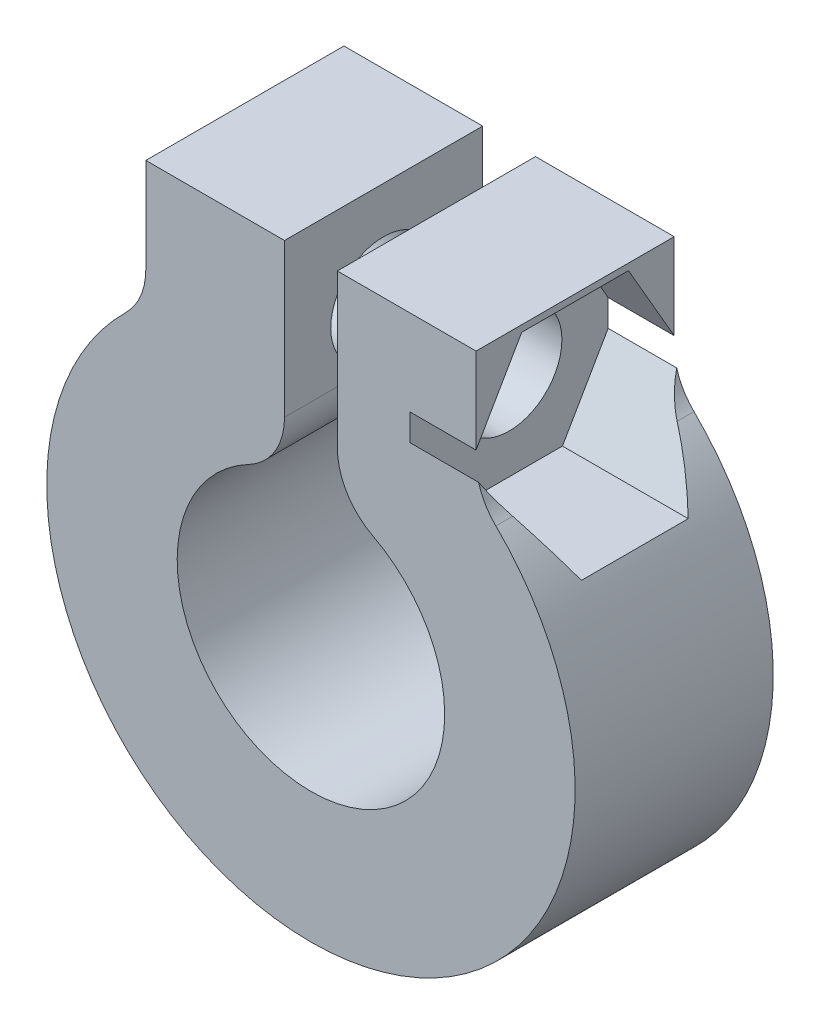
ISO-10303-21;
HEADER;
FILE_DESCRIPTION(('STEP AP214'),'2;1');
FILE_NAME('part.step','',(''),(''),'','','');
FILE_SCHEMA(('AUTOMOTIVE_DESIGN { 1 0 10303 214 1 1 1 1 }'));
ENDSEC;
DATA;
#1=APPLICATION_CONTEXT('core data for automotive mechanical design processes');
#2=APPLICATION_PROTOCOL_DEFINITION('international standard','automotive_design',2000,#1);
#3=PRODUCT_CONTEXT('',#1,'mechanical');
#4=PRODUCT('Part','Part','',(#3));
#5=PRODUCT_RELATED_PRODUCT_CATEGORY('part','',(#4));
#6=PRODUCT_DEFINITION_FORMATION('','',#4);
#7=PRODUCT_DEFINITION_CONTEXT('part definition',#1,'design');
#8=PRODUCT_DEFINITION('design','',#6,#7);
#9=PRODUCT_DEFINITION_SHAPE('','',#8);
#10=(LENGTH_UNIT() NAMED_UNIT(*) SI_UNIT(.MILLI.,.METRE.));
#11=(NAMED_UNIT(*) PLANE_ANGLE_UNIT() SI_UNIT($,.RADIAN.));
#12=(NAMED_UNIT(*) SI_UNIT($,.STERADIAN.) SOLID_ANGLE_UNIT());
#13=UNCERTAINTY_MEASURE_WITH_UNIT(LENGTH_MEASURE(1.E-05),#10,'distance_accuracy_value','');
#14=(GEOMETRIC_REPRESENTATION_CONTEXT(3) GLOBAL_UNCERTAINTY_ASSIGNED_CONTEXT((#13)) GLOBAL_UNIT_ASSIGNED_CONTEXT((#10,
#11,#12)) REPRESENTATION_CONTEXT('',''));
#15=CARTESIAN_POINT('',(0.,0.,0.));
#16=DIRECTION('',(0.,0.,1.));
#17=DIRECTION('',(1.,0.,0.));
#18=AXIS2_PLACEMENT_3D('',#15,#16,#17);
#19=CARTESIAN_POINT('',(0.,0.,6.));
#20=DIRECTION('',(0.,0.,-1.));
#21=DIRECTION('',(-1.,0.,0.));
#22=AXIS2_PLACEMENT_3D('',#19,#20,#21);
#23=CYLINDRICAL_SURFACE('',#22,8.);
#24=CARTESIAN_POINT('',(0.,0.,3.80829037686547));
#25=DIRECTION('',(0.,0.5,0.866025403784439));
#26=DIRECTION('',(0.,0.866025403784439,-0.5));
#27=AXIS2_PLACEMENT_3D('',#24,#25,#26);
#28=ELLIPSE('',#27,9.23760430703401,8.);
#29=CARTESIAN_POINT('',(6.80881781221968,4.2,1.38341924626905));
#30=VERTEX_POINT('',#29);
#31=CARTESIAN_POINT('',(5.6,5.71314274283428,0.509805876371349));
#32=VERTEX_POINT('',#31);
#33=EDGE_CURVE('E230',#30,#32,#28,.T.);
#34=ORIENTED_EDGE('',*,*,#33,.F.);
#35=DIRECTION('',(0.,0.,-1.));
#36=VECTOR('',#35,1.);
#37=CARTESIAN_POINT('',(6.80881781221968,4.2,6.));
#38=LINE('',#37,#36);
#39=CARTESIAN_POINT('',(6.80881781221968,4.2,4.61658075373095));
#40=VERTEX_POINT('',#39);
#41=EDGE_CURVE('E11',#40,#30,#38,.T.);
#42=ORIENTED_EDGE('',*,*,#41,.F.);
#43=CARTESIAN_POINT('',(0.,0.,2.19170962313452));
#44=DIRECTION('',(0.,0.5,-0.866025403784439));
#45=DIRECTION('',(0.,-0.866025403784439,-0.5));
#46=AXIS2_PLACEMENT_3D('',#43,#44,#45);
#47=ELLIPSE('',#46,9.23760430703401,8.);
#48=CARTESIAN_POINT('',(5.6,5.71314274283428,5.49019412362865));
#49=VERTEX_POINT('',#48);
#50=EDGE_CURVE('E234',#49,#40,#47,.T.);
#51=ORIENTED_EDGE('',*,*,#50,.F.);
#52=DIRECTION('',(0.,0.,-1.));
#53=VECTOR('',#52,1.);
#54=CARTESIAN_POINT('',(5.6,5.71314274283428,6.));
#55=LINE('',#54,#53);
#56=CARTESIAN_POINT('',(5.6,5.71314274283428,6.));
#57=VERTEX_POINT('',#56);
#58=EDGE_CURVE('E339',#57,#49,#55,.T.);
#59=ORIENTED_EDGE('',*,*,#58,.F.);
#60=CARTESIAN_POINT('',(0.,0.,6.));
#61=DIRECTION('',(0.,0.,1.));
#62=DIRECTION('',(1.,0.,0.));
#63=AXIS2_PLACEMENT_3D('',#60,#61,#62);
#64=CIRCLE('',#63,8.);
#65=CARTESIAN_POINT('',(-5.6,5.71314274283428,6.));
#66=VERTEX_POINT('',#65);
#67=EDGE_CURVE('E310',#66,#57,#64,.T.);
#68=ORIENTED_EDGE('',*,*,#67,.F.);
#69=DIRECTION('',(0.,0.,-1.));
#70=VECTOR('',#69,1.);
#71=CARTESIAN_POINT('',(-5.6,5.71314274283428,6.));
#72=LINE('',#71,#70);
#73=CARTESIAN_POINT('',(-5.6,5.71314274283428,5.48676464501165));
#74=VERTEX_POINT('',#73);
#75=EDGE_CURVE('E343',#66,#74,#72,.T.);
#76=ORIENTED_EDGE('',*,*,#75,.T.);
#77=CARTESIAN_POINT('',(-5.6,5.71314274283428,0.513235354988352));
#78=CARTESIAN_POINT('',(-5.65841260191976,5.65590457804368,0.542851488995459));
#79=CARTESIAN_POINT('',(-5.71527057067612,5.59839936297946,0.575119081677262));
#80=CARTESIAN_POINT('',(-5.82562419308287,5.48346636189173,0.645289685761073));
#81=CARTESIAN_POINT('',(-5.87911613340435,5.42603872747567,0.683198770863757));
#82=CARTESIAN_POINT('',(-5.98273944102367,5.31157659675637,0.765224965750875));
#83=CARTESIAN_POINT('',(-6.03284294156924,5.25454817516838,0.809386033222885));
#84=CARTESIAN_POINT('',(-6.12892003785086,5.14215905531061,0.903857474884853));
#85=CARTESIAN_POINT('',(-6.17489502518751,5.08679779930198,0.954165763426652));
#86=CARTESIAN_POINT('',(-6.26277086401282,4.97821424841746,1.06138068506756));
#87=CARTESIAN_POINT('',(-6.30463893909999,4.92501088202122,1.1183335266617));
#88=CARTESIAN_POINT('',(-6.38364875183103,4.82216078344485,1.23839168848502));
#89=CARTESIAN_POINT('',(-6.42079120193274,4.77251351562472,1.30149607873752));
#90=CARTESIAN_POINT('',(-6.49003258608079,4.67791658761923,1.43332186127946));
#91=CARTESIAN_POINT('',(-6.52214922715748,4.63295063063398,1.50202217417767));
#92=CARTESIAN_POINT('',(-6.58134669562545,4.54846508837125,1.64469103315218));
#93=CARTESIAN_POINT('',(-6.60842861398425,4.50894432366376,1.71865843309461));
#94=CARTESIAN_POINT('',(-6.67474328739514,4.41060280911192,1.924973810207));
#95=CARTESIAN_POINT('',(-6.70914735010543,4.35772694745215,2.06183154394035));
#96=CARTESIAN_POINT('',(-6.76298426782781,4.27370802874066,2.34489835679647));
#97=CARTESIAN_POINT('',(-6.7824103879135,4.24257474897026,2.49111161072321));
#98=CARTESIAN_POINT('',(-6.80530398049268,4.20574018104803,2.77474714320187));
#99=CARTESIAN_POINT('',(-6.81002418798015,4.19804386742066,2.91181235858912));
#100=CARTESIAN_POINT('',(-6.80709087408471,4.20279998385567,3.18540098733179));
#101=CARTESIAN_POINT('',(-6.79944371115395,4.2152420601443,3.32192464294849));
#102=CARTESIAN_POINT('',(-6.77202228794613,4.25914945588475,3.58783230154106));
#103=CARTESIAN_POINT('',(-6.75248779596968,4.29023849112553,3.71730367031004));
#104=CARTESIAN_POINT('',(-6.70146727470181,4.36950128295825,3.96840707582466));
#105=CARTESIAN_POINT('',(-6.66998069651043,4.41767582419596,4.09003875223201));
#106=CARTESIAN_POINT('',(-6.59444009143915,4.52967807727467,4.32466067911265));
#107=CARTESIAN_POINT('',(-6.55016073291346,4.59378327564791,4.43744525808426));
#108=CARTESIAN_POINT('',(-6.44965699243133,4.73384981886964,4.64946055614281));
#109=CARTESIAN_POINT('',(-6.3934310001081,4.80981276173628,4.74868944500189));
#110=CARTESIAN_POINT('',(-6.26546824374691,4.97549846501485,4.93864973650036));
#111=CARTESIAN_POINT('',(-6.1929286960257,5.06580909145843,5.02832171835174));
#112=CARTESIAN_POINT('',(-6.03619479086219,5.25158102061924,5.19049143542951));
#113=CARTESIAN_POINT('',(-5.95199564917434,5.34704442779881,5.2629820874143));
#114=CARTESIAN_POINT('',(-5.82102926444227,5.48811544268052,5.35735896526323));
#115=CARTESIAN_POINT('',(-5.77817937516774,5.53322716065249,5.38564977214226));
#116=CARTESIAN_POINT('',(-5.69053750000717,5.62331949426635,5.43874377830948));
#117=CARTESIAN_POINT('',(-5.64575151372547,5.66830011028851,5.46355686459065));
#118=CARTESIAN_POINT('',(-5.6,5.71314274283428,5.48676464501165));
#119=B_SPLINE_CURVE_WITH_KNOTS('',3,(#77,#78,#79,#80,#81,#82,#83,#84,#85,#86,#87,#88,#89,#90,
#91,#92,#93,#94,#95,#96,#97,#98,#99,#100,#101,#102,#103,#104,#105,#106,#107,#108,#109,#110,#111,
#112,#113,#114,#115,#116,#117,#118),.UNSPECIFIED.,.F.,.F.,(4,2,2,2,2,2,2,2,2,2,2,2,2,2,2,2,2,2,
2,2,4),(0.,0.260934741232692,0.522152468081195,0.785307564400675,1.04837362327335,
1.31339246721466,1.57837130818092,1.84239446435727,2.10636034284591,2.55575775770598,
3.00535712929024,3.41543442073293,3.82530094562444,4.22716247046868,4.6290424530504,
5.03848456590687,5.44798190526189,5.88574684000295,6.32369193670887,6.52864397831804,
6.73300098948912),.UNSPECIFIED.);
#120=CARTESIAN_POINT('',(-5.6,5.71314274283428,0.513235354988351));
#121=VERTEX_POINT('',#120);
#122=EDGE_CURVE('E269',#121,#74,#119,.T.);
#123=ORIENTED_EDGE('',*,*,#122,.F.);
#124=CARTESIAN_POINT('',(-5.6,5.71314274283428,0.));
#125=VERTEX_POINT('',#124);
#126=EDGE_CURVE('E342',#121,#125,#72,.T.);
#127=ORIENTED_EDGE('',*,*,#126,.T.);
#128=CARTESIAN_POINT('',(0.,0.,0.));
#129=DIRECTION('',(0.,0.,1.));
#130=DIRECTION('',(1.,0.,0.));
#131=AXIS2_PLACEMENT_3D('',#128,#129,#130);
#132=CIRCLE('',#131,8.);
#133=CARTESIAN_POINT('',(5.6,5.71314274283428,0.));
#134=VERTEX_POINT('',#133);
#135=EDGE_CURVE('E290',#125,#134,#132,.T.);
#136=ORIENTED_EDGE('',*,*,#135,.T.);
#137=EDGE_CURVE('E312',#32,#134,#55,.T.);
#138=ORIENTED_EDGE('',*,*,#137,.F.);
#139=EDGE_LOOP('',(#34,#42,#51,#59,#68,#76,#123,#127,#136,#138));
#140=FACE_BOUND('',#139,.T.);
#141=ADVANCED_FACE('F36',(#140),#23,.T.);
#142=CARTESIAN_POINT('',(7.,7.14142842854285,6.));
#143=DIRECTION('',(0.,0.,-1.));
#144=DIRECTION('',(-1.,0.,0.));
#145=AXIS2_PLACEMENT_3D('',#142,#143,#144);
#146=CYLINDRICAL_SURFACE('',#145,2.);
#147=CARTESIAN_POINT('',(7.,7.14142842854285,-0.314815248752183));
#148=DIRECTION('',(0.,0.5,0.866025403784439));
#149=DIRECTION('',(0.,0.866025403784439,-0.5));
#150=AXIS2_PLACEMENT_3D('',#147,#148,#149);
#151=ELLIPSE('',#150,2.3094010767585,2.);
#152=CARTESIAN_POINT('',(5.07576662604057,6.59615242270663,0.));
#153=VERTEX_POINT('',#152);
#154=EDGE_CURVE('E228',#32,#153,#151,.F.);
#155=ORIENTED_EDGE('',*,*,#154,.F.);
#156=ORIENTED_EDGE('',*,*,#137,.T.);
#157=CARTESIAN_POINT('',(7.,7.14142842854285,0.));
#158=DIRECTION('',(0.,0.,-1.));
#159=DIRECTION('',(1.,0.,0.));
#160=AXIS2_PLACEMENT_3D('',#157,#158,#159);
#161=CIRCLE('',#160,2.);
#162=EDGE_CURVE('E285',#134,#153,#161,.T.);
#163=ORIENTED_EDGE('',*,*,#162,.T.);
#164=EDGE_LOOP('',(#155,#156,#163));
#165=FACE_BOUND('',#164,.T.);
#166=ADVANCED_FACE('F38',(#165),#146,.F.);
#167=CARTESIAN_POINT('',(7.,7.14142842854285,6.31481524875218));
#168=DIRECTION('',(0.,0.5,-0.866025403784439));
#169=DIRECTION('',(0.,-0.866025403784439,-0.5));
#170=AXIS2_PLACEMENT_3D('',#167,#168,#169);
#171=ELLIPSE('',#170,2.3094010767585,2.);
#172=CARTESIAN_POINT('',(5.07576662604057,6.59615242270663,6.));
#173=VERTEX_POINT('',#172);
#174=EDGE_CURVE('E232',#173,#49,#171,.F.);
#175=ORIENTED_EDGE('',*,*,#174,.F.);
#176=CARTESIAN_POINT('',(7.,7.14142842854285,6.));
#177=DIRECTION('',(0.,0.,-1.));
#178=DIRECTION('',(1.,0.,0.));
#179=AXIS2_PLACEMENT_3D('',#176,#177,#178);
#180=CIRCLE('',#179,2.);
#181=EDGE_CURVE('E286',#57,#173,#180,.T.);
#182=ORIENTED_EDGE('',*,*,#181,.F.);
#183=ORIENTED_EDGE('',*,*,#58,.T.);
#184=EDGE_LOOP('',(#175,#182,#183));
#185=FACE_BOUND('',#184,.T.);
#186=ADVANCED_FACE('F400',(#185),#146,.F.);
#187=CARTESIAN_POINT('',(5.,10.,6.));
#188=DIRECTION('',(-1.,0.,0.));
#189=DIRECTION('',(0.,0.,1.));
#190=AXIS2_PLACEMENT_3D('',#187,#188,#189);
#191=PLANE('',#190);
#192=DIRECTION('',(0.,0.866025403784439,0.5));
#193=VECTOR('',#192,1.);
#194=CARTESIAN_POINT('',(5.,11.9490381056767,2.62416697508023));
#195=LINE('',#194,#193);
#196=CARTESIAN_POINT('',(5.,7.40384757729337,0.));
#197=VERTEX_POINT('',#196);
#198=CARTESIAN_POINT('',(5.,9.8,1.38341924626905));
#199=VERTEX_POINT('',#198);
#200=EDGE_CURVE('E191',#197,#199,#195,.T.);
#201=ORIENTED_EDGE('',*,*,#200,.F.);
#202=DIRECTION('',(0.,1.,0.));
#203=VECTOR('',#202,1.);
#204=CARTESIAN_POINT('',(5.,10.,0.));
#205=LINE('',#204,#203);
#206=CARTESIAN_POINT('',(5.,10.,0.));
#207=VERTEX_POINT('',#206);
#208=EDGE_CURVE('E315',#197,#207,#205,.T.);
#209=ORIENTED_EDGE('',*,*,#208,.T.);
#210=DIRECTION('',(0.,0.,-1.));
#211=VECTOR('',#210,1.);
#212=CARTESIAN_POINT('',(5.,10.,6.));
#213=LINE('',#212,#211);
#214=CARTESIAN_POINT('',(5.,10.,6.));
#215=VERTEX_POINT('',#214);
#216=EDGE_CURVE('E371',#215,#207,#213,.T.);
#217=ORIENTED_EDGE('',*,*,#216,.F.);
#218=DIRECTION('',(0.,1.,0.));
#219=VECTOR('',#218,1.);
#220=CARTESIAN_POINT('',(5.,10.,6.));
#221=LINE('',#220,#219);
#222=CARTESIAN_POINT('',(5.,7.40384757729336,6.));
#223=VERTEX_POINT('',#222);
#224=EDGE_CURVE('E289',#223,#215,#221,.T.);
#225=ORIENTED_EDGE('',*,*,#224,.F.);
#226=DIRECTION('',(0.,-0.866025403784439,0.5));
#227=VECTOR('',#226,1.);
#228=CARTESIAN_POINT('',(5.,9.35096189432334,4.87583302491977));
#229=LINE('',#228,#227);
#230=CARTESIAN_POINT('',(5.,9.8,4.61658075373095));
#231=VERTEX_POINT('',#230);
#232=EDGE_CURVE('E236',#231,#223,#229,.T.);
#233=ORIENTED_EDGE('',*,*,#232,.F.);
#234=DIRECTION('',(0.,0.,1.));
#235=VECTOR('',#234,1.);
#236=CARTESIAN_POINT('',(5.,9.8,6.));
#237=LINE('',#236,#235);
#238=EDGE_CURVE('E44',#199,#231,#237,.T.);
#239=ORIENTED_EDGE('',*,*,#238,.F.);
#240=EDGE_LOOP('',(#201,#209,#217,#225,#233,#239));
#241=FACE_BOUND('',#240,.T.);
#242=ADVANCED_FACE('F409',(#241),#191,.F.);
#243=CARTESIAN_POINT('',(7.,7.14142842854285,6.));
#244=DIRECTION('',(0.,0.,1.));
#245=DIRECTION('',(1.,0.,0.));
#246=AXIS2_PLACEMENT_3D('',#243,#244,#245);
#247=PLANE('',#246);
#248=DIRECTION('',(0.,1.,0.));
#249=VECTOR('',#248,1.);
#250=CARTESIAN_POINT('',(3.,7.14142842854285,6.));
#251=LINE('',#250,#249);
#252=CARTESIAN_POINT('',(3.,6.59615242270663,6.));
#253=VERTEX_POINT('',#252);
#254=CARTESIAN_POINT('',(3.,7.40384757729336,6.));
#255=VERTEX_POINT('',#254);
#256=EDGE_CURVE('E224',#253,#255,#251,.T.);
#257=ORIENTED_EDGE('',*,*,#256,.T.);
#258=DIRECTION('',(1.,0.,0.));
#259=VECTOR('',#258,1.);
#260=CARTESIAN_POINT('',(7.,7.40384757729336,6.));
#261=LINE('',#260,#259);
#262=EDGE_CURVE('E417',#255,#223,#261,.T.);
#263=ORIENTED_EDGE('',*,*,#262,.T.);
#264=ORIENTED_EDGE('',*,*,#224,.T.);
#265=DIRECTION('',(-1.,0.,0.));
#266=VECTOR('',#265,1.);
#267=CARTESIAN_POINT('',(0.8,10.,6.));
#268=LINE('',#267,#266);
#269=CARTESIAN_POINT('',(0.8,10.,6.));
#270=VERTEX_POINT('',#269);
#271=EDGE_CURVE('E292',#215,#270,#268,.T.);
#272=ORIENTED_EDGE('',*,*,#271,.T.);
#273=DIRECTION('',(0.,-1.,0.));
#274=VECTOR('',#273,1.);
#275=CARTESIAN_POINT('',(0.8,10.,6.));
#276=LINE('',#275,#274);
#277=CARTESIAN_POINT('',(0.8,5.36306815172062,6.));
#278=VERTEX_POINT('',#277);
#279=EDGE_CURVE('E294',#270,#278,#276,.T.);
#280=ORIENTED_EDGE('',*,*,#279,.T.);
#281=CARTESIAN_POINT('',(2.8,5.36306815172062,6.));
#282=DIRECTION('',(0.,0.,1.));
#283=DIRECTION('',(-1.,0.,0.));
#284=AXIS2_PLACEMENT_3D('',#281,#282,#283);
#285=CIRCLE('',#284,2.);
#286=CARTESIAN_POINT('',(1.87438016528926,3.59015306024273,6.));
#287=VERTEX_POINT('',#286);
#288=EDGE_CURVE('E296',#278,#287,#285,.T.);
#289=ORIENTED_EDGE('',*,*,#288,.T.);
#290=CARTESIAN_POINT('',(0.,0.,6.));
#291=DIRECTION('',(0.,0.,-1.));
#292=DIRECTION('',(1.,0.,0.));
#293=AXIS2_PLACEMENT_3D('',#290,#291,#292);
#294=CIRCLE('',#293,4.05);
#295=CARTESIAN_POINT('',(-1.87438016528926,3.59015306024273,6.));
#296=VERTEX_POINT('',#295);
#297=EDGE_CURVE('E298',#287,#296,#294,.T.);
#298=ORIENTED_EDGE('',*,*,#297,.T.);
#299=CARTESIAN_POINT('',(-2.8,5.36306815172062,6.));
#300=DIRECTION('',(0.,0.,1.));
#301=DIRECTION('',(-1.,0.,0.));
#302=AXIS2_PLACEMENT_3D('',#299,#300,#301);
#303=CIRCLE('',#302,2.);
#304=CARTESIAN_POINT('',(-0.799999999999999,5.36306815172062,6.));
#305=VERTEX_POINT('',#304);
#306=EDGE_CURVE('E300',#296,#305,#303,.T.);
#307=ORIENTED_EDGE('',*,*,#306,.T.);
#308=DIRECTION('',(0.,1.,0.));
#309=VECTOR('',#308,1.);
#310=CARTESIAN_POINT('',(-0.8,10.,6.));
#311=LINE('',#310,#309);
#312=CARTESIAN_POINT('',(-0.8,10.,6.));
#313=VERTEX_POINT('',#312);
#314=EDGE_CURVE('E302',#305,#313,#311,.T.);
#315=ORIENTED_EDGE('',*,*,#314,.T.);
#316=DIRECTION('',(-1.,0.,0.));
#317=VECTOR('',#316,1.);
#318=CARTESIAN_POINT('',(-5.,10.,6.));
#319=LINE('',#318,#317);
#320=CARTESIAN_POINT('',(-5.,10.,6.));
#321=VERTEX_POINT('',#320);
#322=EDGE_CURVE('E304',#313,#321,#319,.T.);
#323=ORIENTED_EDGE('',*,*,#322,.T.);
#324=DIRECTION('',(0.,-1.,0.));
#325=VECTOR('',#324,1.);
#326=CARTESIAN_POINT('',(-5.,7.14142842854285,6.));
#327=LINE('',#326,#325);
#328=CARTESIAN_POINT('',(-5.,7.14142842854285,6.));
#329=VERTEX_POINT('',#328);
#330=EDGE_CURVE('E306',#321,#329,#327,.T.);
#331=ORIENTED_EDGE('',*,*,#330,.T.);
#332=CARTESIAN_POINT('',(-7.,7.14142842854285,6.));
#333=DIRECTION('',(0.,0.,-1.));
#334=DIRECTION('',(-1.,0.,0.));
#335=AXIS2_PLACEMENT_3D('',#332,#333,#334);
#336=CIRCLE('',#335,2.);
#337=EDGE_CURVE('E308',#329,#66,#336,.T.);
#338=ORIENTED_EDGE('',*,*,#337,.T.);
#339=ORIENTED_EDGE('',*,*,#67,.T.);
#340=ORIENTED_EDGE('',*,*,#181,.T.);
#341=DIRECTION('',(-1.,0.,0.));
#342=VECTOR('',#341,1.);
#343=CARTESIAN_POINT('',(7.,6.59615242270663,6.));
#344=LINE('',#343,#342);
#345=EDGE_CURVE('E419',#173,#253,#344,.T.);
#346=ORIENTED_EDGE('',*,*,#345,.T.);
#347=EDGE_LOOP('',(#257,#263,#264,#272,#280,#289,#298,#307,#315,#323,#331,#338,#339,#340,#346));
#348=FACE_BOUND('',#347,.T.);
#349=ADVANCED_FACE('F406',(#348),#247,.T.);
#350=CARTESIAN_POINT('',(7.,7.14142842854285,0.));
#351=DIRECTION('',(0.,0.,1.));
#352=DIRECTION('',(1.,0.,0.));
#353=AXIS2_PLACEMENT_3D('',#350,#351,#352);
#354=PLANE('',#353);
#355=DIRECTION('',(-1.,0.,0.));
#356=VECTOR('',#355,1.);
#357=CARTESIAN_POINT('',(7.,6.59615242270663,0.));
#358=LINE('',#357,#356);
#359=CARTESIAN_POINT('',(3.,6.59615242270663,0.));
#360=VERTEX_POINT('',#359);
#361=EDGE_CURVE('E440',#153,#360,#358,.T.);
#362=ORIENTED_EDGE('',*,*,#361,.F.);
#363=ORIENTED_EDGE('',*,*,#162,.F.);
#364=ORIENTED_EDGE('',*,*,#135,.F.);
#365=CARTESIAN_POINT('',(-7.,7.14142842854285,0.));
#366=DIRECTION('',(0.,0.,-1.));
#367=DIRECTION('',(-1.,0.,0.));
#368=AXIS2_PLACEMENT_3D('',#365,#366,#367);
#369=CIRCLE('',#368,2.);
#370=CARTESIAN_POINT('',(-5.,7.14142842854285,0.));
#371=VERTEX_POINT('',#370);
#372=EDGE_CURVE('E334',#371,#125,#369,.T.);
#373=ORIENTED_EDGE('',*,*,#372,.F.);
#374=DIRECTION('',(0.,-1.,0.));
#375=VECTOR('',#374,1.);
#376=CARTESIAN_POINT('',(-5.,7.14142842854285,0.));
#377=LINE('',#376,#375);
#378=CARTESIAN_POINT('',(-5.,10.,0.));
#379=VERTEX_POINT('',#378);
#380=EDGE_CURVE('E331',#379,#371,#377,.T.);
#381=ORIENTED_EDGE('',*,*,#380,.F.);
#382=DIRECTION('',(-1.,0.,0.));
#383=VECTOR('',#382,1.);
#384=CARTESIAN_POINT('',(-5.,10.,0.));
#385=LINE('',#384,#383);
#386=CARTESIAN_POINT('',(-0.8,10.,0.));
#387=VERTEX_POINT('',#386);
#388=EDGE_CURVE('E329',#387,#379,#385,.T.);
#389=ORIENTED_EDGE('',*,*,#388,.F.);
#390=DIRECTION('',(0.,1.,0.));
#391=VECTOR('',#390,1.);
#392=CARTESIAN_POINT('',(-0.8,10.,0.));
#393=LINE('',#392,#391);
#394=CARTESIAN_POINT('',(-0.799999999999999,5.36306815172062,0.));
#395=VERTEX_POINT('',#394);
#396=EDGE_CURVE('E327',#395,#387,#393,.T.);
#397=ORIENTED_EDGE('',*,*,#396,.F.);
#398=CARTESIAN_POINT('',(-2.8,5.36306815172062,0.));
#399=DIRECTION('',(0.,0.,1.));
#400=DIRECTION('',(-1.,0.,0.));
#401=AXIS2_PLACEMENT_3D('',#398,#399,#400);
#402=CIRCLE('',#401,2.);
#403=CARTESIAN_POINT('',(-1.87438016528926,3.59015306024273,0.));
#404=VERTEX_POINT('',#403);
#405=EDGE_CURVE('E325',#404,#395,#402,.T.);
#406=ORIENTED_EDGE('',*,*,#405,.F.);
#407=CARTESIAN_POINT('',(0.,0.,0.));
#408=DIRECTION('',(0.,0.,-1.));
#409=DIRECTION('',(1.,0.,0.));
#410=AXIS2_PLACEMENT_3D('',#407,#408,#409);
#411=CIRCLE('',#410,4.05);
#412=CARTESIAN_POINT('',(1.87438016528926,3.59015306024273,0.));
#413=VERTEX_POINT('',#412);
#414=EDGE_CURVE('E323',#413,#404,#411,.T.);
#415=ORIENTED_EDGE('',*,*,#414,.F.);
#416=CARTESIAN_POINT('',(2.8,5.36306815172062,0.));
#417=DIRECTION('',(0.,0.,1.));
#418=DIRECTION('',(-1.,0.,0.));
#419=AXIS2_PLACEMENT_3D('',#416,#417,#418);
#420=CIRCLE('',#419,2.);
#421=CARTESIAN_POINT('',(0.8,5.36306815172062,0.));
#422=VERTEX_POINT('',#421);
#423=EDGE_CURVE('E321',#422,#413,#420,.T.);
#424=ORIENTED_EDGE('',*,*,#423,.F.);
#425=DIRECTION('',(0.,-1.,0.));
#426=VECTOR('',#425,1.);
#427=CARTESIAN_POINT('',(0.8,10.,0.));
#428=LINE('',#427,#426);
#429=CARTESIAN_POINT('',(0.8,10.,0.));
#430=VERTEX_POINT('',#429);
#431=EDGE_CURVE('E319',#430,#422,#428,.T.);
#432=ORIENTED_EDGE('',*,*,#431,.F.);
#433=DIRECTION('',(-1.,0.,0.));
#434=VECTOR('',#433,1.);
#435=CARTESIAN_POINT('',(0.8,10.,0.));
#436=LINE('',#435,#434);
#437=EDGE_CURVE('E317',#207,#430,#436,.T.);
#438=ORIENTED_EDGE('',*,*,#437,.F.);
#439=ORIENTED_EDGE('',*,*,#208,.F.);
#440=DIRECTION('',(1.,0.,0.));
#441=VECTOR('',#440,1.);
#442=CARTESIAN_POINT('',(7.,7.40384757729337,0.));
#443=LINE('',#442,#441);
#444=CARTESIAN_POINT('',(3.,7.40384757729337,0.));
#445=VERTEX_POINT('',#444);
#446=EDGE_CURVE('E441',#445,#197,#443,.T.);
#447=ORIENTED_EDGE('',*,*,#446,.F.);
#448=DIRECTION('',(0.,1.,0.));
#449=VECTOR('',#448,1.);
#450=CARTESIAN_POINT('',(3.,7.14142842854285,0.));
#451=LINE('',#450,#449);
#452=EDGE_CURVE('E205',#360,#445,#451,.T.);
#453=ORIENTED_EDGE('',*,*,#452,.F.);
#454=EDGE_LOOP('',(#362,#363,#364,#373,#381,#389,#397,#406,#415,#424,#432,#438,#439,#447,#453));
#455=FACE_BOUND('',#454,.T.);
#456=ADVANCED_FACE('F393',(#455),#354,.F.);
#457=CARTESIAN_POINT('',(8.,7.,3.));
#458=DIRECTION('',(-1.,0.,0.));
#459=DIRECTION('',(0.,0.,1.));
#460=AXIS2_PLACEMENT_3D('',#457,#458,#459);
#461=CYLINDRICAL_SURFACE('',#460,1.6);
#462=CARTESIAN_POINT('',(0.8,7.,3.));
#463=DIRECTION('',(1.,0.,0.));
#464=DIRECTION('',(0.,1.,0.));
#465=AXIS2_PLACEMENT_3D('',#462,#463,#464);
#466=CIRCLE('',#465,1.6);
#467=CARTESIAN_POINT('',(0.8,8.6,3.));
#468=VERTEX_POINT('',#467);
#469=EDGE_CURVE('E282',#468,#468,#466,.T.);
#470=ORIENTED_EDGE('',*,*,#469,.F.);
#471=EDGE_LOOP('',(#470));
#472=FACE_BOUND('',#471,.T.);
#473=CARTESIAN_POINT('',(3.,7.,3.));
#474=DIRECTION('',(1.,0.,0.));
#475=DIRECTION('',(0.,0.,-1.));
#476=AXIS2_PLACEMENT_3D('',#473,#474,#475);
#477=CIRCLE('',#476,1.6);
#478=CARTESIAN_POINT('',(3.,7.,1.4));
#479=VERTEX_POINT('',#478);
#480=EDGE_CURVE('E195',#479,#479,#477,.F.);
#481=ORIENTED_EDGE('',*,*,#480,.F.);
#482=EDGE_LOOP('',(#481));
#483=FACE_BOUND('',#482,.T.);
#484=ADVANCED_FACE('F264',(#472,#483),#461,.F.);
#485=CARTESIAN_POINT('',(-7.,7.14142842854285,6.));
#486=DIRECTION('',(0.,0.,-1.));
#487=DIRECTION('',(-1.,0.,0.));
#488=AXIS2_PLACEMENT_3D('',#485,#486,#487);
#489=CYLINDRICAL_SURFACE('',#488,2.);
#490=CARTESIAN_POINT('',(-5.,7.14142842854285,0.203574066848919));
#491=CARTESIAN_POINT('',(-4.99998996376799,7.09246534031337,0.201087071048072));
#492=CARTESIAN_POINT('',(-5.00179774636285,7.04344120781381,0.199907345850637));
#493=CARTESIAN_POINT('',(-5.00900150388293,6.94568551985948,0.200103208814733));
#494=CARTESIAN_POINT('',(-5.01439574552152,6.89695383454263,0.201477563200186));
#495=CARTESIAN_POINT('',(-5.02867006226468,6.80052117395843,0.2066999505779));
#496=CARTESIAN_POINT('',(-5.0375230637454,6.75281515839544,0.210528915661002));
#497=CARTESIAN_POINT('',(-5.05859918232329,6.65841191332633,0.220508304838398));
#498=CARTESIAN_POINT('',(-5.07082249282626,6.61171474187881,0.226658862165163));
#499=CARTESIAN_POINT('',(-5.11230031752735,6.47376124524569,0.248327725730303));
#500=CARTESIAN_POINT('',(-5.14639775408109,6.38441148245148,0.267077050455166));
#501=CARTESIAN_POINT('',(-5.22616874797217,6.21270328285261,0.311492030066029));
#502=CARTESIAN_POINT('',(-5.2718732482938,6.13036433202235,0.337176184090974));
#503=CARTESIAN_POINT('',(-5.36297286910296,5.99006350391405,0.387646357552761));
#504=CARTESIAN_POINT('',(-5.40652047637716,5.93055965107558,0.411542237251799));
#505=CARTESIAN_POINT('',(-5.49919800497105,5.81745557498976,0.461220251226978));
#506=CARTESIAN_POINT('',(-5.54829991110103,5.76382819280053,0.486992704487246));
#507=CARTESIAN_POINT('',(-5.6,5.71314274283428,0.51323535498835));
#508=B_SPLINE_CURVE_WITH_KNOTS('',3,(#490,#491,#492,#493,#494,#495,#496,#497,#498,#499,#500,
#501,#502,#503,#504,#505,#506,#507),.UNSPECIFIED.,.F.,.F.,(4,2,2,2,2,2,2,2,4),(0.,
0.147019442153003,0.293967883416141,0.439788408885574,0.585617304034617,0.876580774415455,
1.1683282122943,1.40042269863954,1.63139474992941),.UNSPECIFIED.);
#509=CARTESIAN_POINT('',(-5.,7.14142842854285,0.203574066848919));
#510=VERTEX_POINT('',#509);
#511=EDGE_CURVE('E59',#510,#121,#508,.T.);
#512=ORIENTED_EDGE('',*,*,#511,.F.);
#513=DIRECTION('',(0.,0.,-1.));
#514=VECTOR('',#513,1.);
#515=CARTESIAN_POINT('',(-5.,7.14142842854285,6.));
#516=LINE('',#515,#514);
#517=EDGE_CURVE('E346',#510,#371,#516,.T.);
#518=ORIENTED_EDGE('',*,*,#517,.T.);
#519=ORIENTED_EDGE('',*,*,#372,.T.);
#520=ORIENTED_EDGE('',*,*,#126,.F.);
#521=EDGE_LOOP('',(#512,#518,#519,#520));
#522=FACE_BOUND('',#521,.T.);
#523=ADVANCED_FACE('F251',(#522),#489,.F.);
#524=CARTESIAN_POINT('',(-5.,7.14142842854285,6.));
#525=DIRECTION('',(1.,0.,0.));
#526=DIRECTION('',(0.,0.,-1.));
#527=AXIS2_PLACEMENT_3D('',#524,#525,#526);
#528=PLANE('',#527);
#529=CARTESIAN_POINT('',(-5.,7.,3.));
#530=DIRECTION('',(1.,0.,0.));
#531=DIRECTION('',(0.,0.,-1.));
#532=AXIS2_PLACEMENT_3D('',#529,#530,#531);
#533=CIRCLE('',#532,2.8);
#534=CARTESIAN_POINT('',(-5.,7.14142842854285,5.79642593315108));
#535=VERTEX_POINT('',#534);
#536=EDGE_CURVE('E249',#535,#510,#533,.F.);
#537=ORIENTED_EDGE('',*,*,#536,.F.);
#538=EDGE_CURVE('E347',#329,#535,#516,.T.);
#539=ORIENTED_EDGE('',*,*,#538,.F.);
#540=ORIENTED_EDGE('',*,*,#330,.F.);
#541=DIRECTION('',(0.,0.,-1.));
#542=VECTOR('',#541,1.);
#543=CARTESIAN_POINT('',(-5.,10.,6.));
#544=LINE('',#543,#542);
#545=EDGE_CURVE('E350',#321,#379,#544,.T.);
#546=ORIENTED_EDGE('',*,*,#545,.T.);
#547=ORIENTED_EDGE('',*,*,#380,.T.);
#548=ORIENTED_EDGE('',*,*,#517,.F.);
#549=EDGE_LOOP('',(#537,#539,#540,#546,#547,#548));
#550=FACE_BOUND('',#549,.T.);
#551=ADVANCED_FACE('F389',(#550),#528,.F.);
#552=CARTESIAN_POINT('',(-5.6,5.71314274283428,5.48676464501165));
#553=CARTESIAN_POINT('',(-5.56258857560063,5.74982057747006,5.50574592368518));
#554=CARTESIAN_POINT('',(-5.52655835885979,5.78801342463516,5.52447956367441));
#555=CARTESIAN_POINT('',(-5.45740276849682,5.86739038233268,5.56107534142412));
#556=CARTESIAN_POINT('',(-5.4242796951116,5.90857681522679,5.57893678420106));
#557=CARTESIAN_POINT('',(-5.3291040605532,6.03710775131483,5.63085731496787));
#558=CARTESIAN_POINT('',(-5.27180329989331,6.12888018846157,5.66296041429284));
#559=CARTESIAN_POINT('',(-5.17174585647378,6.32322345545918,5.71886239250416));
#560=CARTESIAN_POINT('',(-5.12907298240879,6.42585224160728,5.74261343871519));
#561=CARTESIAN_POINT('',(-5.07814461035301,6.58503455527849,5.76960389347774));
#562=CARTESIAN_POINT('',(-5.06336578215806,6.63885190481831,5.77715460437165));
#563=CARTESIAN_POINT('',(-5.03831315849215,6.74785043017975,5.7891606925793));
#564=CARTESIAN_POINT('',(-5.02803647799719,6.8030307085997,5.79361805321766));
#565=CARTESIAN_POINT('',(-5.01341837535355,6.90536985810602,5.79879183128542));
#566=CARTESIAN_POINT('',(-5.00839290774714,6.9524086052877,5.79999049772663));
#567=CARTESIAN_POINT('',(-5.00167738948899,7.04679177973872,5.80000944881444));
#568=CARTESIAN_POINT('',(-4.99999216250759,7.09413655016817,5.79882629881842));
#569=CARTESIAN_POINT('',(-4.99999999999991,7.14142842854283,5.79642593315119));
#570=B_SPLINE_CURVE_WITH_KNOTS('',3,(#552,#553,#554,#555,#556,#557,#558,#559,#560,#561,#562,
#563,#564,#565,#566,#567,#568,#569),.UNSPECIFIED.,.F.,.F.,(4,2,2,2,2,2,2,2,4),(0.,
0.16709918985332,0.334329424615073,0.671259107259777,1.01008812799884,1.17880658346646,
1.34741676364676,1.48920881153731,1.63120547379215),.UNSPECIFIED.);
#571=EDGE_CURVE('E242',#74,#535,#570,.T.);
#572=ORIENTED_EDGE('',*,*,#571,.F.);
#573=ORIENTED_EDGE('',*,*,#75,.F.);
#574=ORIENTED_EDGE('',*,*,#337,.F.);
#575=ORIENTED_EDGE('',*,*,#538,.T.);
#576=EDGE_LOOP('',(#572,#573,#574,#575));
#577=FACE_BOUND('',#576,.T.);
#578=ADVANCED_FACE('F380',(#577),#489,.F.);
#579=CARTESIAN_POINT('',(-0.8,7.,3.));
#580=DIRECTION('',(-1.,0.,0.));
#581=DIRECTION('',(0.,-1.,0.));
#582=AXIS2_PLACEMENT_3D('',#579,#580,#581);
#583=CIRCLE('',#582,1.6);
#584=CARTESIAN_POINT('',(-0.8,5.4,3.));
#585=VERTEX_POINT('',#584);
#586=EDGE_CURVE('E279',#585,#585,#583,.T.);
#587=ORIENTED_EDGE('',*,*,#586,.F.);
#588=EDGE_LOOP('',(#587));
#589=FACE_BOUND('',#588,.T.);
#590=CARTESIAN_POINT('',(-4.,7.,3.));
#591=DIRECTION('',(-1.,0.,0.));
#592=DIRECTION('',(0.,0.,1.));
#593=AXIS2_PLACEMENT_3D('',#590,#591,#592);
#594=CIRCLE('',#593,1.6);
#595=CARTESIAN_POINT('',(-4.,7.,4.6));
#596=VERTEX_POINT('',#595);
#597=EDGE_CURVE('E241',#596,#596,#594,.F.);
#598=ORIENTED_EDGE('',*,*,#597,.F.);
#599=EDGE_LOOP('',(#598));
#600=FACE_BOUND('',#599,.T.);
#601=ADVANCED_FACE('F377',(#589,#600),#461,.F.);
#602=CARTESIAN_POINT('',(0.8,10.,6.));
#603=DIRECTION('',(0.,-1.,0.));
#604=DIRECTION('',(0.,0.,-1.));
#605=AXIS2_PLACEMENT_3D('',#602,#603,#604);
#606=PLANE('',#605);
#607=ORIENTED_EDGE('',*,*,#437,.T.);
#608=DIRECTION('',(0.,0.,-1.));
#609=VECTOR('',#608,1.);
#610=CARTESIAN_POINT('',(0.8,10.,6.));
#611=LINE('',#610,#609);
#612=EDGE_CURVE('E368',#270,#430,#611,.T.);
#613=ORIENTED_EDGE('',*,*,#612,.F.);
#614=ORIENTED_EDGE('',*,*,#271,.F.);
#615=ORIENTED_EDGE('',*,*,#216,.T.);
#616=EDGE_LOOP('',(#607,#613,#614,#615));
#617=FACE_BOUND('',#616,.T.);
#618=ADVANCED_FACE('F379',(#617),#606,.F.);
#619=CARTESIAN_POINT('',(0.8,10.,6.));
#620=DIRECTION('',(1.,0.,0.));
#621=DIRECTION('',(0.,1.,0.));
#622=AXIS2_PLACEMENT_3D('',#619,#620,#621);
#623=PLANE('',#622);
#624=ORIENTED_EDGE('',*,*,#469,.T.);
#625=EDGE_LOOP('',(#624));
#626=FACE_BOUND('',#625,.T.);
#627=ORIENTED_EDGE('',*,*,#431,.T.);
#628=DIRECTION('',(0.,0.,-1.));
#629=VECTOR('',#628,1.);
#630=CARTESIAN_POINT('',(0.8,5.36306815172062,6.));
#631=LINE('',#630,#629);
#632=EDGE_CURVE('E365',#278,#422,#631,.T.);
#633=ORIENTED_EDGE('',*,*,#632,.F.);
#634=ORIENTED_EDGE('',*,*,#279,.F.);
#635=ORIENTED_EDGE('',*,*,#612,.T.);
#636=EDGE_LOOP('',(#627,#633,#634,#635));
#637=FACE_BOUND('',#636,.T.);
#638=ADVANCED_FACE('F386',(#626,#637),#623,.F.);
#639=CARTESIAN_POINT('',(2.8,5.36306815172062,6.));
#640=DIRECTION('',(0.,0.,-1.));
#641=DIRECTION('',(-1.,0.,0.));
#642=AXIS2_PLACEMENT_3D('',#639,#640,#641);
#643=CYLINDRICAL_SURFACE('',#642,2.);
#644=ORIENTED_EDGE('',*,*,#423,.T.);
#645=DIRECTION('',(0.,0.,-1.));
#646=VECTOR('',#645,1.);
#647=CARTESIAN_POINT('',(1.87438016528926,3.59015306024273,6.));
#648=LINE('',#647,#646);
#649=EDGE_CURVE('E362',#287,#413,#648,.T.);
#650=ORIENTED_EDGE('',*,*,#649,.F.);
#651=ORIENTED_EDGE('',*,*,#288,.F.);
#652=ORIENTED_EDGE('',*,*,#632,.T.);
#653=EDGE_LOOP('',(#644,#650,#651,#652));
#654=FACE_BOUND('',#653,.T.);
#655=ADVANCED_FACE('F461',(#654),#643,.T.);
#656=CARTESIAN_POINT('',(0.,0.,6.));
#657=DIRECTION('',(0.,0.,-1.));
#658=DIRECTION('',(-1.,0.,0.));
#659=AXIS2_PLACEMENT_3D('',#656,#657,#658);
#660=CYLINDRICAL_SURFACE('',#659,4.05);
#661=ORIENTED_EDGE('',*,*,#414,.T.);
#662=DIRECTION('',(0.,0.,-1.));
#663=VECTOR('',#662,1.);
#664=CARTESIAN_POINT('',(-1.87438016528926,3.59015306024273,6.));
#665=LINE('',#664,#663);
#666=EDGE_CURVE('E359',#296,#404,#665,.T.);
#667=ORIENTED_EDGE('',*,*,#666,.F.);
#668=ORIENTED_EDGE('',*,*,#297,.F.);
#669=ORIENTED_EDGE('',*,*,#649,.T.);
#670=EDGE_LOOP('',(#661,#667,#668,#669));
#671=FACE_BOUND('',#670,.T.);
#672=ADVANCED_FACE('F467',(#671),#660,.F.);
#673=CARTESIAN_POINT('',(-2.8,5.36306815172062,6.));
#674=DIRECTION('',(0.,0.,-1.));
#675=DIRECTION('',(-1.,0.,0.));
#676=AXIS2_PLACEMENT_3D('',#673,#674,#675);
#677=CYLINDRICAL_SURFACE('',#676,2.);
#678=ORIENTED_EDGE('',*,*,#405,.T.);
#679=DIRECTION('',(0.,0.,-1.));
#680=VECTOR('',#679,1.);
#681=CARTESIAN_POINT('',(-0.799999999999999,5.36306815172062,6.));
#682=LINE('',#681,#680);
#683=EDGE_CURVE('E356',#305,#395,#682,.T.);
#684=ORIENTED_EDGE('',*,*,#683,.F.);
#685=ORIENTED_EDGE('',*,*,#306,.F.);
#686=ORIENTED_EDGE('',*,*,#666,.T.);
#687=EDGE_LOOP('',(#678,#684,#685,#686));
#688=FACE_BOUND('',#687,.T.);
#689=ADVANCED_FACE('F471',(#688),#677,.T.);
#690=CARTESIAN_POINT('',(-0.8,10.,6.));
#691=DIRECTION('',(-1.,0.,0.));
#692=DIRECTION('',(0.,-1.,0.));
#693=AXIS2_PLACEMENT_3D('',#690,#691,#692);
#694=PLANE('',#693);
#695=ORIENTED_EDGE('',*,*,#586,.T.);
#696=EDGE_LOOP('',(#695));
#697=FACE_BOUND('',#696,.T.);
#698=ORIENTED_EDGE('',*,*,#396,.T.);
#699=DIRECTION('',(0.,0.,-1.));
#700=VECTOR('',#699,1.);
#701=CARTESIAN_POINT('',(-0.8,10.,6.));
#702=LINE('',#701,#700);
#703=EDGE_CURVE('E353',#313,#387,#702,.T.);
#704=ORIENTED_EDGE('',*,*,#703,.F.);
#705=ORIENTED_EDGE('',*,*,#314,.F.);
#706=ORIENTED_EDGE('',*,*,#683,.T.);
#707=EDGE_LOOP('',(#698,#704,#705,#706));
#708=FACE_BOUND('',#707,.T.);
#709=ADVANCED_FACE('F476',(#697,#708),#694,.F.);
#710=CARTESIAN_POINT('',(-5.,10.,6.));
#711=DIRECTION('',(0.,-1.,0.));
#712=DIRECTION('',(0.,0.,-1.));
#713=AXIS2_PLACEMENT_3D('',#710,#711,#712);
#714=PLANE('',#713);
#715=ORIENTED_EDGE('',*,*,#388,.T.);
#716=ORIENTED_EDGE('',*,*,#545,.F.);
#717=ORIENTED_EDGE('',*,*,#322,.F.);
#718=ORIENTED_EDGE('',*,*,#703,.T.);
#719=EDGE_LOOP('',(#715,#716,#717,#718));
#720=FACE_BOUND('',#719,.T.);
#721=ADVANCED_FACE('F261',(#720),#714,.F.);
#722=CARTESIAN_POINT('',(-8.,7.,3.));
#723=DIRECTION('',(1.,0.,0.));
#724=DIRECTION('',(0.,0.,-1.));
#725=AXIS2_PLACEMENT_3D('',#722,#723,#724);
#726=CYLINDRICAL_SURFACE('',#725,2.8);
#727=CARTESIAN_POINT('',(-4.,7.,3.));
#728=DIRECTION('',(-1.,0.,0.));
#729=DIRECTION('',(0.,0.,1.));
#730=AXIS2_PLACEMENT_3D('',#727,#728,#729);
#731=CIRCLE('',#730,2.8);
#732=CARTESIAN_POINT('',(-4.,7.,5.8));
#733=VERTEX_POINT('',#732);
#734=EDGE_CURVE('E238',#733,#733,#731,.T.);
#735=ORIENTED_EDGE('',*,*,#734,.F.);
#736=EDGE_LOOP('',(#735));
#737=FACE_BOUND('',#736,.T.);
#738=ORIENTED_EDGE('',*,*,#511,.T.);
#739=ORIENTED_EDGE('',*,*,#122,.T.);
#740=ORIENTED_EDGE('',*,*,#571,.T.);
#741=ORIENTED_EDGE('',*,*,#536,.T.);
#742=EDGE_LOOP('',(#738,#739,#740,#741));
#743=FACE_BOUND('',#742,.T.);
#744=ADVANCED_FACE('F255',(#737,#743),#726,.F.);
#745=CARTESIAN_POINT('',(-4.,7.,3.));
#746=DIRECTION('',(-1.,0.,0.));
#747=DIRECTION('',(0.,0.,1.));
#748=AXIS2_PLACEMENT_3D('',#745,#746,#747);
#749=PLANE('',#748);
#750=ORIENTED_EDGE('',*,*,#734,.T.);
#751=EDGE_LOOP('',(#750));
#752=FACE_BOUND('',#751,.T.);
#753=ORIENTED_EDGE('',*,*,#597,.T.);
#754=EDGE_LOOP('',(#753));
#755=FACE_BOUND('',#754,.T.);
#756=ADVANCED_FACE('F260',(#752,#755),#749,.T.);
#757=CARTESIAN_POINT('',(8.,4.2,4.61658075373095));
#758=DIRECTION('',(0.,1.,0.));
#759=DIRECTION('',(0.,0.,1.));
#760=AXIS2_PLACEMENT_3D('',#757,#758,#759);
#761=PLANE('',#760);
#762=ORIENTED_EDGE('',*,*,#41,.T.);
#763=DIRECTION('',(-1.,0.,0.));
#764=VECTOR('',#763,1.);
#765=CARTESIAN_POINT('',(8.,4.2,1.38341924626905));
#766=LINE('',#765,#764);
#767=CARTESIAN_POINT('',(3.,4.2,1.38341924626905));
#768=VERTEX_POINT('',#767);
#769=EDGE_CURVE('E218',#30,#768,#766,.T.);
#770=ORIENTED_EDGE('',*,*,#769,.T.);
#771=DIRECTION('',(0.,0.,-1.));
#772=VECTOR('',#771,1.);
#773=CARTESIAN_POINT('',(3.,4.2,4.61658075373095));
#774=LINE('',#773,#772);
#775=CARTESIAN_POINT('',(3.,4.2,4.61658075373095));
#776=VERTEX_POINT('',#775);
#777=EDGE_CURVE('E216',#776,#768,#774,.T.);
#778=ORIENTED_EDGE('',*,*,#777,.F.);
#779=DIRECTION('',(-1.,0.,0.));
#780=VECTOR('',#779,1.);
#781=CARTESIAN_POINT('',(8.,4.2,4.61658075373095));
#782=LINE('',#781,#780);
#783=EDGE_CURVE('E220',#40,#776,#782,.T.);
#784=ORIENTED_EDGE('',*,*,#783,.F.);
#785=EDGE_LOOP('',(#762,#770,#778,#784));
#786=FACE_BOUND('',#785,.T.);
#787=ADVANCED_FACE('F429',(#786),#761,.T.);
#788=CARTESIAN_POINT('',(8.,9.8,1.38341924626905));
#789=DIRECTION('',(0.,-1.,0.));
#790=DIRECTION('',(0.,0.,-1.));
#791=AXIS2_PLACEMENT_3D('',#788,#789,#790);
#792=PLANE('',#791);
#793=ORIENTED_EDGE('',*,*,#238,.T.);
#794=DIRECTION('',(-1.,0.,0.));
#795=VECTOR('',#794,1.);
#796=CARTESIAN_POINT('',(8.,9.8,4.61658075373095));
#797=LINE('',#796,#795);
#798=CARTESIAN_POINT('',(3.,9.8,4.61658075373095));
#799=VERTEX_POINT('',#798);
#800=EDGE_CURVE('E196',#231,#799,#797,.T.);
#801=ORIENTED_EDGE('',*,*,#800,.T.);
#802=DIRECTION('',(0.,0.,1.));
#803=VECTOR('',#802,1.);
#804=CARTESIAN_POINT('',(3.,9.8,1.38341924626905));
#805=LINE('',#804,#803);
#806=CARTESIAN_POINT('',(3.,9.8,1.38341924626905));
#807=VERTEX_POINT('',#806);
#808=EDGE_CURVE('E202',#807,#799,#805,.T.);
#809=ORIENTED_EDGE('',*,*,#808,.F.);
#810=DIRECTION('',(-1.,0.,0.));
#811=VECTOR('',#810,1.);
#812=CARTESIAN_POINT('',(8.,9.8,1.38341924626905));
#813=LINE('',#812,#811);
#814=EDGE_CURVE('E185',#199,#807,#813,.T.);
#815=ORIENTED_EDGE('',*,*,#814,.F.);
#816=EDGE_LOOP('',(#793,#801,#809,#815));
#817=FACE_BOUND('',#816,.T.);
#818=ADVANCED_FACE('F207',(#817),#792,.T.);
#819=CARTESIAN_POINT('',(8.,9.8,4.61658075373095));
#820=DIRECTION('',(0.,-0.5,-0.866025403784439));
#821=DIRECTION('',(0.,0.866025403784439,-0.5));
#822=AXIS2_PLACEMENT_3D('',#819,#820,#821);
#823=PLANE('',#822);
#824=ORIENTED_EDGE('',*,*,#232,.T.);
#825=ORIENTED_EDGE('',*,*,#262,.F.);
#826=DIRECTION('',(0.,-0.866025403784439,0.5));
#827=VECTOR('',#826,1.);
#828=CARTESIAN_POINT('',(3.,9.8,4.61658075373095));
#829=LINE('',#828,#827);
#830=EDGE_CURVE('E209',#799,#255,#829,.T.);
#831=ORIENTED_EDGE('',*,*,#830,.F.);
#832=ORIENTED_EDGE('',*,*,#800,.F.);
#833=EDGE_LOOP('',(#824,#825,#831,#832));
#834=FACE_BOUND('',#833,.T.);
#835=ADVANCED_FACE('F448',(#834),#823,.T.);
#836=CARTESIAN_POINT('',(8.,7.,6.2331615074619));
#837=DIRECTION('',(0.,0.5,-0.866025403784439));
#838=DIRECTION('',(0.,0.866025403784439,0.5));
#839=AXIS2_PLACEMENT_3D('',#836,#837,#838);
#840=PLANE('',#839);
#841=ORIENTED_EDGE('',*,*,#50,.T.);
#842=ORIENTED_EDGE('',*,*,#783,.T.);
#843=DIRECTION('',(0.,-0.866025403784438,-0.5));
#844=VECTOR('',#843,1.);
#845=CARTESIAN_POINT('',(3.,7.,6.2331615074619));
#846=LINE('',#845,#844);
#847=EDGE_CURVE('E211',#253,#776,#846,.T.);
#848=ORIENTED_EDGE('',*,*,#847,.F.);
#849=ORIENTED_EDGE('',*,*,#345,.F.);
#850=ORIENTED_EDGE('',*,*,#174,.T.);
#851=EDGE_LOOP('',(#841,#842,#848,#849,#850));
#852=FACE_BOUND('',#851,.T.);
#853=ADVANCED_FACE('F423',(#852),#840,.T.);
#854=CARTESIAN_POINT('',(8.,4.2,1.38341924626905));
#855=DIRECTION('',(0.,0.5,0.866025403784439));
#856=DIRECTION('',(0.,-0.866025403784439,0.5));
#857=AXIS2_PLACEMENT_3D('',#854,#855,#856);
#858=PLANE('',#857);
#859=ORIENTED_EDGE('',*,*,#33,.T.);
#860=ORIENTED_EDGE('',*,*,#154,.T.);
#861=ORIENTED_EDGE('',*,*,#361,.T.);
#862=DIRECTION('',(0.,0.866025403784439,-0.5));
#863=VECTOR('',#862,1.);
#864=CARTESIAN_POINT('',(3.,4.2,1.38341924626905));
#865=LINE('',#864,#863);
#866=EDGE_CURVE('E51',#768,#360,#865,.T.);
#867=ORIENTED_EDGE('',*,*,#866,.F.);
#868=ORIENTED_EDGE('',*,*,#769,.F.);
#869=EDGE_LOOP('',(#859,#860,#861,#867,#868));
#870=FACE_BOUND('',#869,.T.);
#871=ADVANCED_FACE('F435',(#870),#858,.T.);
#872=CARTESIAN_POINT('',(8.,7.,-0.233161507461904));
#873=DIRECTION('',(0.,-0.5,0.866025403784439));
#874=DIRECTION('',(0.,-0.866025403784439,-0.5));
#875=AXIS2_PLACEMENT_3D('',#872,#873,#874);
#876=PLANE('',#875);
#877=ORIENTED_EDGE('',*,*,#200,.T.);
#878=ORIENTED_EDGE('',*,*,#814,.T.);
#879=DIRECTION('',(0.,0.866025403784439,0.5));
#880=VECTOR('',#879,1.);
#881=CARTESIAN_POINT('',(3.,7.,-0.233161507461904));
#882=LINE('',#881,#880);
#883=EDGE_CURVE('E188',#445,#807,#882,.T.);
#884=ORIENTED_EDGE('',*,*,#883,.F.);
#885=ORIENTED_EDGE('',*,*,#446,.T.);
#886=EDGE_LOOP('',(#877,#878,#884,#885));
#887=FACE_BOUND('',#886,.T.);
#888=ADVANCED_FACE('F187',(#887),#876,.T.);
#889=CARTESIAN_POINT('',(3.,0.,0.));
#890=DIRECTION('',(1.,0.,0.));
#891=DIRECTION('',(0.,0.,-1.));
#892=AXIS2_PLACEMENT_3D('',#889,#890,#891);
#893=PLANE('',#892);
#894=ORIENTED_EDGE('',*,*,#480,.T.);
#895=EDGE_LOOP('',(#894));
#896=FACE_BOUND('',#895,.T.);
#897=ORIENTED_EDGE('',*,*,#847,.T.);
#898=ORIENTED_EDGE('',*,*,#777,.T.);
#899=ORIENTED_EDGE('',*,*,#866,.T.);
#900=ORIENTED_EDGE('',*,*,#452,.T.);
#901=ORIENTED_EDGE('',*,*,#883,.T.);
#902=ORIENTED_EDGE('',*,*,#808,.T.);
#903=ORIENTED_EDGE('',*,*,#830,.T.);
#904=ORIENTED_EDGE('',*,*,#256,.F.);
#905=EDGE_LOOP('',(#897,#898,#899,#900,#901,#902,#903,#904));
#906=FACE_BOUND('',#905,.T.);
#907=ADVANCED_FACE('F200',(#896,#906),#893,.T.);
#908=CLOSED_SHELL('',(#141,#166,#186,#242,#349,#456,#484,#523,#551,#578,#601,#618,#638,#655,
#672,#689,#709,#721,#744,#756,#787,#818,#835,#853,#871,#888,#907));
#909=MANIFOLD_SOLID_BREP('B2',#908);
#910=ADVANCED_BREP_SHAPE_REPRESENTATION('',(#18,#909),#14);
#911=SHAPE_DEFINITION_REPRESENTATION(#9,#910);
ENDSEC;
END-ISO-10303-21;
